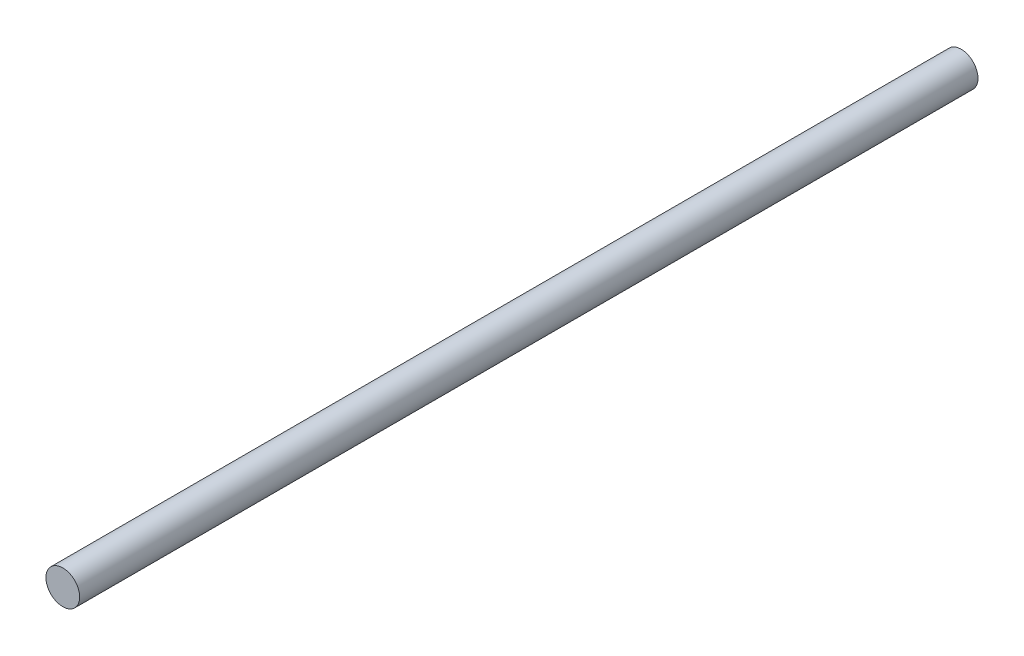
ISO-10303-21;
HEADER;
FILE_DESCRIPTION(('STEP AP214'),'2;1');
FILE_NAME('part.step','',(''),(''),'','','');
FILE_SCHEMA(('AUTOMOTIVE_DESIGN { 1 0 10303 214 1 1 1 1 }'));
ENDSEC;
DATA;
#1=APPLICATION_CONTEXT('core data for automotive mechanical design processes');
#2=APPLICATION_PROTOCOL_DEFINITION('international standard','automotive_design',2000,#1);
#3=PRODUCT_CONTEXT('',#1,'mechanical');
#4=PRODUCT('Part','Part','',(#3));
#5=PRODUCT_RELATED_PRODUCT_CATEGORY('part','',(#4));
#6=PRODUCT_DEFINITION_FORMATION('','',#4);
#7=PRODUCT_DEFINITION_CONTEXT('part definition',#1,'design');
#8=PRODUCT_DEFINITION('design','',#6,#7);
#9=PRODUCT_DEFINITION_SHAPE('','',#8);
#10=(LENGTH_UNIT() NAMED_UNIT(*) SI_UNIT(.MILLI.,.METRE.));
#11=(NAMED_UNIT(*) PLANE_ANGLE_UNIT() SI_UNIT($,.RADIAN.));
#12=(NAMED_UNIT(*) SI_UNIT($,.STERADIAN.) SOLID_ANGLE_UNIT());
#13=UNCERTAINTY_MEASURE_WITH_UNIT(LENGTH_MEASURE(1.E-05),#10,'distance_accuracy_value','');
#14=(GEOMETRIC_REPRESENTATION_CONTEXT(3) GLOBAL_UNCERTAINTY_ASSIGNED_CONTEXT((#13)) GLOBAL_UNIT_ASSIGNED_CONTEXT((#10,
#11,#12)) REPRESENTATION_CONTEXT('',''));
#15=CARTESIAN_POINT('',(0.,0.,0.));
#16=DIRECTION('',(0.,0.,1.));
#17=DIRECTION('',(1.,0.,0.));
#18=AXIS2_PLACEMENT_3D('',#15,#16,#17);
#19=CARTESIAN_POINT('',(0.,0.,160.));
#20=DIRECTION('',(0.,0.,-1.));
#21=DIRECTION('',(-1.,0.,0.));
#22=AXIS2_PLACEMENT_3D('',#19,#20,#21);
#23=CYLINDRICAL_SURFACE('',#22,3.);
#24=CARTESIAN_POINT('',(0.,0.,160.));
#25=DIRECTION('',(0.,0.,1.));
#26=DIRECTION('',(1.,0.,0.));
#27=AXIS2_PLACEMENT_3D('',#24,#25,#26);
#28=CIRCLE('',#27,3.);
#29=CARTESIAN_POINT('',(3.,0.,160.));
#30=VERTEX_POINT('',#29);
#31=EDGE_CURVE('E10',#30,#30,#28,.T.);
#32=ORIENTED_EDGE('',*,*,#31,.F.);
#33=EDGE_LOOP('',(#32));
#34=FACE_BOUND('',#33,.T.);
#35=CARTESIAN_POINT('',(0.,0.,0.));
#36=DIRECTION('',(0.,0.,1.));
#37=DIRECTION('',(1.,0.,0.));
#38=AXIS2_PLACEMENT_3D('',#35,#36,#37);
#39=CIRCLE('',#38,3.);
#40=CARTESIAN_POINT('',(3.,0.,0.));
#41=VERTEX_POINT('',#40);
#42=EDGE_CURVE('E39',#41,#41,#39,.T.);
#43=ORIENTED_EDGE('',*,*,#42,.T.);
#44=EDGE_LOOP('',(#43));
#45=FACE_BOUND('',#44,.T.);
#46=ADVANCED_FACE('F36',(#34,#45),#23,.T.);
#47=CARTESIAN_POINT('',(0.,0.,160.));
#48=DIRECTION('',(0.,0.,1.));
#49=DIRECTION('',(1.,0.,0.));
#50=AXIS2_PLACEMENT_3D('',#47,#48,#49);
#51=PLANE('',#50);
#52=ORIENTED_EDGE('',*,*,#31,.T.);
#53=EDGE_LOOP('',(#52));
#54=FACE_BOUND('',#53,.T.);
#55=ADVANCED_FACE('F51',(#54),#51,.T.);
#56=CARTESIAN_POINT('',(0.,0.,0.));
#57=DIRECTION('',(0.,0.,1.));
#58=DIRECTION('',(1.,0.,0.));
#59=AXIS2_PLACEMENT_3D('',#56,#57,#58);
#60=PLANE('',#59);
#61=ORIENTED_EDGE('',*,*,#42,.F.);
#62=EDGE_LOOP('',(#61));
#63=FACE_BOUND('',#62,.T.);
#64=ADVANCED_FACE('F49',(#63),#60,.F.);
#65=CLOSED_SHELL('',(#46,#55,#64));
#66=MANIFOLD_SOLID_BREP('B2',#65);
#67=ADVANCED_BREP_SHAPE_REPRESENTATION('',(#18,#66),#14);
#68=SHAPE_DEFINITION_REPRESENTATION(#9,#67);
ENDSEC;
END-ISO-10303-21;
